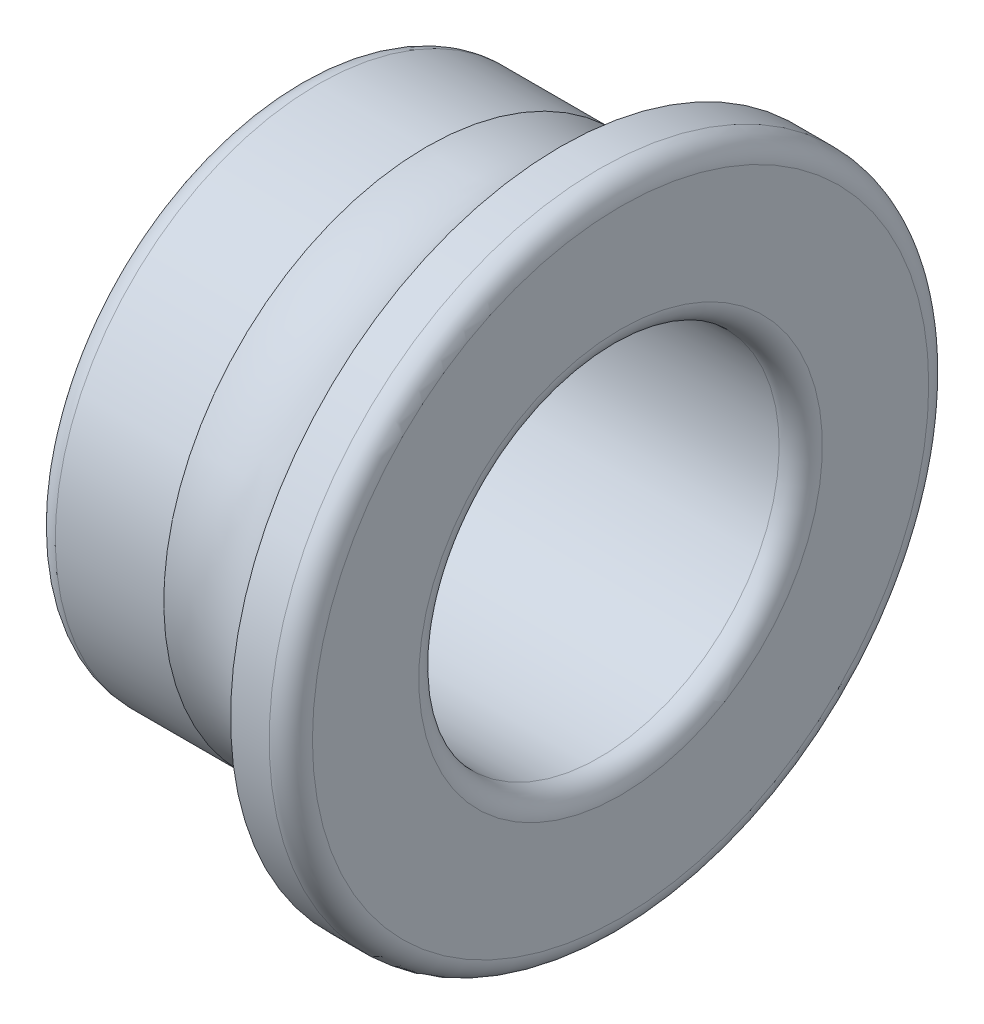
ISO-10303-21;
HEADER;
FILE_DESCRIPTION(('STEP AP214'),'2;1');
FILE_NAME('part.step','',(''),(''),'','','');
FILE_SCHEMA(('AUTOMOTIVE_DESIGN { 1 0 10303 214 1 1 1 1 }'));
ENDSEC;
DATA;
#1=APPLICATION_CONTEXT('core data for automotive mechanical design processes');
#2=APPLICATION_PROTOCOL_DEFINITION('international standard','automotive_design',2000,#1);
#3=PRODUCT_CONTEXT('',#1,'mechanical');
#4=PRODUCT('Part','Part','',(#3));
#5=PRODUCT_RELATED_PRODUCT_CATEGORY('part','',(#4));
#6=PRODUCT_DEFINITION_FORMATION('','',#4);
#7=PRODUCT_DEFINITION_CONTEXT('part definition',#1,'design');
#8=PRODUCT_DEFINITION('design','',#6,#7);
#9=PRODUCT_DEFINITION_SHAPE('','',#8);
#10=(LENGTH_UNIT() NAMED_UNIT(*) SI_UNIT(.MILLI.,.METRE.));
#11=(NAMED_UNIT(*) PLANE_ANGLE_UNIT() SI_UNIT($,.RADIAN.));
#12=(NAMED_UNIT(*) SI_UNIT($,.STERADIAN.) SOLID_ANGLE_UNIT());
#13=UNCERTAINTY_MEASURE_WITH_UNIT(LENGTH_MEASURE(1.E-05),#10,'distance_accuracy_value','');
#14=(GEOMETRIC_REPRESENTATION_CONTEXT(3) GLOBAL_UNCERTAINTY_ASSIGNED_CONTEXT((#13)) GLOBAL_UNIT_ASSIGNED_CONTEXT((#10,
#11,#12)) REPRESENTATION_CONTEXT('',''));
#15=CARTESIAN_POINT('',(0.,0.,0.));
#16=DIRECTION('',(0.,0.,1.));
#17=DIRECTION('',(1.,0.,0.));
#18=AXIS2_PLACEMENT_3D('',#15,#16,#17);
#19=CARTESIAN_POINT('',(8.4,0.,0.));
#20=DIRECTION('',(1.,0.,0.));
#21=DIRECTION('',(0.,0.,-1.));
#22=AXIS2_PLACEMENT_3D('',#19,#20,#21);
#23=TOROIDAL_SURFACE('',#22,5.6,0.6);
#24=CARTESIAN_POINT('',(9.,0.,0.));
#25=DIRECTION('',(1.,0.,0.));
#26=DIRECTION('',(0.,1.,0.));
#27=AXIS2_PLACEMENT_3D('',#24,#25,#26);
#28=CIRCLE('',#27,5.6);
#29=CARTESIAN_POINT('',(9.,5.6,0.));
#30=VERTEX_POINT('',#29);
#31=EDGE_CURVE('E11',#30,#30,#28,.T.);
#32=ORIENTED_EDGE('',*,*,#31,.T.);
#33=EDGE_LOOP('',(#32));
#34=FACE_BOUND('',#33,.T.);
#35=CARTESIAN_POINT('',(8.4,0.,0.));
#36=DIRECTION('',(1.,0.,0.));
#37=DIRECTION('',(0.,1.,0.));
#38=AXIS2_PLACEMENT_3D('',#35,#36,#37);
#39=CIRCLE('',#38,5.);
#40=CARTESIAN_POINT('',(8.4,5.,0.));
#41=VERTEX_POINT('',#40);
#42=EDGE_CURVE('E63',#41,#41,#39,.T.);
#43=ORIENTED_EDGE('',*,*,#42,.F.);
#44=EDGE_LOOP('',(#43));
#45=FACE_BOUND('',#44,.T.);
#46=ADVANCED_FACE('F17',(#34,#45),#23,.T.);
#47=CARTESIAN_POINT('',(9.,7.075,0.));
#48=DIRECTION('',(1.,0.,0.));
#49=DIRECTION('',(0.,1.,0.));
#50=AXIS2_PLACEMENT_3D('',#47,#48,#49);
#51=PLANE('',#50);
#52=CARTESIAN_POINT('',(9.,0.,0.));
#53=DIRECTION('',(1.,0.,0.));
#54=DIRECTION('',(0.,1.,0.));
#55=AXIS2_PLACEMENT_3D('',#52,#53,#54);
#56=CIRCLE('',#55,8.55);
#57=CARTESIAN_POINT('',(9.,8.55,0.));
#58=VERTEX_POINT('',#57);
#59=EDGE_CURVE('E21',#58,#58,#56,.T.);
#60=ORIENTED_EDGE('',*,*,#59,.T.);
#61=EDGE_LOOP('',(#60));
#62=FACE_BOUND('',#61,.T.);
#63=ORIENTED_EDGE('',*,*,#31,.F.);
#64=EDGE_LOOP('',(#63));
#65=FACE_BOUND('',#64,.T.);
#66=ADVANCED_FACE('F93',(#62,#65),#51,.T.);
#67=CARTESIAN_POINT('',(8.4,0.,0.));
#68=DIRECTION('',(1.,0.,0.));
#69=DIRECTION('',(0.,0.,-1.));
#70=AXIS2_PLACEMENT_3D('',#67,#68,#69);
#71=TOROIDAL_SURFACE('',#70,8.55,0.6);
#72=CARTESIAN_POINT('',(8.4,0.,0.));
#73=DIRECTION('',(1.,0.,0.));
#74=DIRECTION('',(0.,1.,0.));
#75=AXIS2_PLACEMENT_3D('',#72,#73,#74);
#76=CIRCLE('',#75,9.15);
#77=CARTESIAN_POINT('',(8.4,9.15,0.));
#78=VERTEX_POINT('',#77);
#79=EDGE_CURVE('E75',#78,#78,#76,.T.);
#80=ORIENTED_EDGE('',*,*,#79,.T.);
#81=EDGE_LOOP('',(#80));
#82=FACE_BOUND('',#81,.T.);
#83=ORIENTED_EDGE('',*,*,#59,.F.);
#84=EDGE_LOOP('',(#83));
#85=FACE_BOUND('',#84,.T.);
#86=ADVANCED_FACE('F98',(#82,#85),#71,.T.);
#87=CARTESIAN_POINT('',(7.8642135623731,0.,0.));
#88=DIRECTION('',(-1.,0.,0.));
#89=DIRECTION('',(0.,1.,0.));
#90=AXIS2_PLACEMENT_3D('',#87,#88,#89);
#91=CYLINDRICAL_SURFACE('',#90,9.15);
#92=CARTESIAN_POINT('',(7.32842712474619,0.,0.));
#93=DIRECTION('',(1.,0.,0.));
#94=DIRECTION('',(0.,1.,0.));
#95=AXIS2_PLACEMENT_3D('',#92,#93,#94);
#96=CIRCLE('',#95,9.15);
#97=CARTESIAN_POINT('',(7.32842712474619,9.15,0.));
#98=VERTEX_POINT('',#97);
#99=EDGE_CURVE('E69',#98,#98,#96,.T.);
#100=ORIENTED_EDGE('',*,*,#99,.T.);
#101=EDGE_LOOP('',(#100));
#102=FACE_BOUND('',#101,.T.);
#103=ORIENTED_EDGE('',*,*,#79,.F.);
#104=EDGE_LOOP('',(#103));
#105=FACE_BOUND('',#104,.T.);
#106=ADVANCED_FACE('F106',(#102,#105),#91,.T.);
#107=CARTESIAN_POINT('',(4.5,0.,0.));
#108=DIRECTION('',(1.,0.,0.));
#109=DIRECTION('',(0.,0.,-1.));
#110=AXIS2_PLACEMENT_3D('',#107,#108,#109);
#111=TOROIDAL_SURFACE('',#110,10.15,3.);
#112=CARTESIAN_POINT('',(3.61018260300217,0.,0.));
#113=DIRECTION('',(1.,0.,0.));
#114=DIRECTION('',(0.,1.,0.));
#115=AXIS2_PLACEMENT_3D('',#112,#113,#114);
#116=CIRCLE('',#115,7.285);
#117=CARTESIAN_POINT('',(3.61018260300217,7.285,0.));
#118=VERTEX_POINT('',#117);
#119=EDGE_CURVE('E67',#118,#118,#116,.T.);
#120=ORIENTED_EDGE('',*,*,#119,.T.);
#121=EDGE_LOOP('',(#120));
#122=FACE_BOUND('',#121,.T.);
#123=ORIENTED_EDGE('',*,*,#99,.F.);
#124=EDGE_LOOP('',(#123));
#125=FACE_BOUND('',#124,.T.);
#126=ADVANCED_FACE('F102',(#122,#125),#111,.F.);
#127=CARTESIAN_POINT('',(2.10509130150108,0.,0.));
#128=DIRECTION('',(-1.,0.,0.));
#129=DIRECTION('',(0.,1.,0.));
#130=AXIS2_PLACEMENT_3D('',#127,#128,#129);
#131=CYLINDRICAL_SURFACE('',#130,7.285);
#132=CARTESIAN_POINT('',(0.6,0.,0.));
#133=DIRECTION('',(1.,0.,0.));
#134=DIRECTION('',(0.,1.,0.));
#135=AXIS2_PLACEMENT_3D('',#132,#133,#134);
#136=CIRCLE('',#135,7.285);
#137=CARTESIAN_POINT('',(0.6,7.285,0.));
#138=VERTEX_POINT('',#137);
#139=EDGE_CURVE('E70',#138,#138,#136,.T.);
#140=ORIENTED_EDGE('',*,*,#139,.T.);
#141=EDGE_LOOP('',(#140));
#142=FACE_BOUND('',#141,.T.);
#143=ORIENTED_EDGE('',*,*,#119,.F.);
#144=EDGE_LOOP('',(#143));
#145=FACE_BOUND('',#144,.T.);
#146=ADVANCED_FACE('F105',(#142,#145),#131,.T.);
#147=CARTESIAN_POINT('',(0.6,0.,0.));
#148=DIRECTION('',(1.,0.,0.));
#149=DIRECTION('',(0.,0.,-1.));
#150=AXIS2_PLACEMENT_3D('',#147,#148,#149);
#151=TOROIDAL_SURFACE('',#150,6.685,0.6);
#152=CARTESIAN_POINT('',(0.,0.,0.));
#153=DIRECTION('',(1.,0.,0.));
#154=DIRECTION('',(0.,1.,0.));
#155=AXIS2_PLACEMENT_3D('',#152,#153,#154);
#156=CIRCLE('',#155,6.685);
#157=CARTESIAN_POINT('',(0.,6.685,0.));
#158=VERTEX_POINT('',#157);
#159=EDGE_CURVE('E72',#158,#158,#156,.T.);
#160=ORIENTED_EDGE('',*,*,#159,.T.);
#161=EDGE_LOOP('',(#160));
#162=FACE_BOUND('',#161,.T.);
#163=ORIENTED_EDGE('',*,*,#139,.F.);
#164=EDGE_LOOP('',(#163));
#165=FACE_BOUND('',#164,.T.);
#166=ADVANCED_FACE('F90',(#162,#165),#151,.T.);
#167=CARTESIAN_POINT('',(0.,6.1425,0.));
#168=DIRECTION('',(-1.,0.,0.));
#169=DIRECTION('',(0.,-1.,0.));
#170=AXIS2_PLACEMENT_3D('',#167,#168,#169);
#171=PLANE('',#170);
#172=CARTESIAN_POINT('',(0.,0.,0.));
#173=DIRECTION('',(1.,0.,0.));
#174=DIRECTION('',(0.,1.,0.));
#175=AXIS2_PLACEMENT_3D('',#172,#173,#174);
#176=CIRCLE('',#175,5.6);
#177=CARTESIAN_POINT('',(0.,5.6,0.));
#178=VERTEX_POINT('',#177);
#179=EDGE_CURVE('E64',#178,#178,#176,.T.);
#180=ORIENTED_EDGE('',*,*,#179,.T.);
#181=EDGE_LOOP('',(#180));
#182=FACE_BOUND('',#181,.T.);
#183=ORIENTED_EDGE('',*,*,#159,.F.);
#184=EDGE_LOOP('',(#183));
#185=FACE_BOUND('',#184,.T.);
#186=ADVANCED_FACE('F19',(#182,#185),#171,.T.);
#187=CARTESIAN_POINT('',(0.6,0.,0.));
#188=DIRECTION('',(1.,0.,0.));
#189=DIRECTION('',(0.,0.,-1.));
#190=AXIS2_PLACEMENT_3D('',#187,#188,#189);
#191=TOROIDAL_SURFACE('',#190,5.6,0.6);
#192=CARTESIAN_POINT('',(0.6,0.,0.));
#193=DIRECTION('',(1.,0.,0.));
#194=DIRECTION('',(0.,1.,0.));
#195=AXIS2_PLACEMENT_3D('',#192,#193,#194);
#196=CIRCLE('',#195,5.);
#197=CARTESIAN_POINT('',(0.6,5.,0.));
#198=VERTEX_POINT('',#197);
#199=EDGE_CURVE('E59',#198,#198,#196,.T.);
#200=ORIENTED_EDGE('',*,*,#199,.T.);
#201=EDGE_LOOP('',(#200));
#202=FACE_BOUND('',#201,.T.);
#203=ORIENTED_EDGE('',*,*,#179,.F.);
#204=EDGE_LOOP('',(#203));
#205=FACE_BOUND('',#204,.T.);
#206=ADVANCED_FACE('F60',(#202,#205),#191,.T.);
#207=CARTESIAN_POINT('',(4.5,0.,0.));
#208=DIRECTION('',(-1.,0.,0.));
#209=DIRECTION('',(0.,1.,0.));
#210=AXIS2_PLACEMENT_3D('',#207,#208,#209);
#211=CYLINDRICAL_SURFACE('',#210,5.);
#212=ORIENTED_EDGE('',*,*,#42,.T.);
#213=EDGE_LOOP('',(#212));
#214=FACE_BOUND('',#213,.T.);
#215=ORIENTED_EDGE('',*,*,#199,.F.);
#216=EDGE_LOOP('',(#215));
#217=FACE_BOUND('',#216,.T.);
#218=ADVANCED_FACE('F81',(#214,#217),#211,.F.);
#219=CLOSED_SHELL('',(#46,#66,#86,#106,#126,#146,#166,#186,#206,#218));
#220=MANIFOLD_SOLID_BREP('B1',#219);
#221=ADVANCED_BREP_SHAPE_REPRESENTATION('',(#18,#220),#14);
#222=SHAPE_DEFINITION_REPRESENTATION(#9,#221);
ENDSEC;
END-ISO-10303-21;
